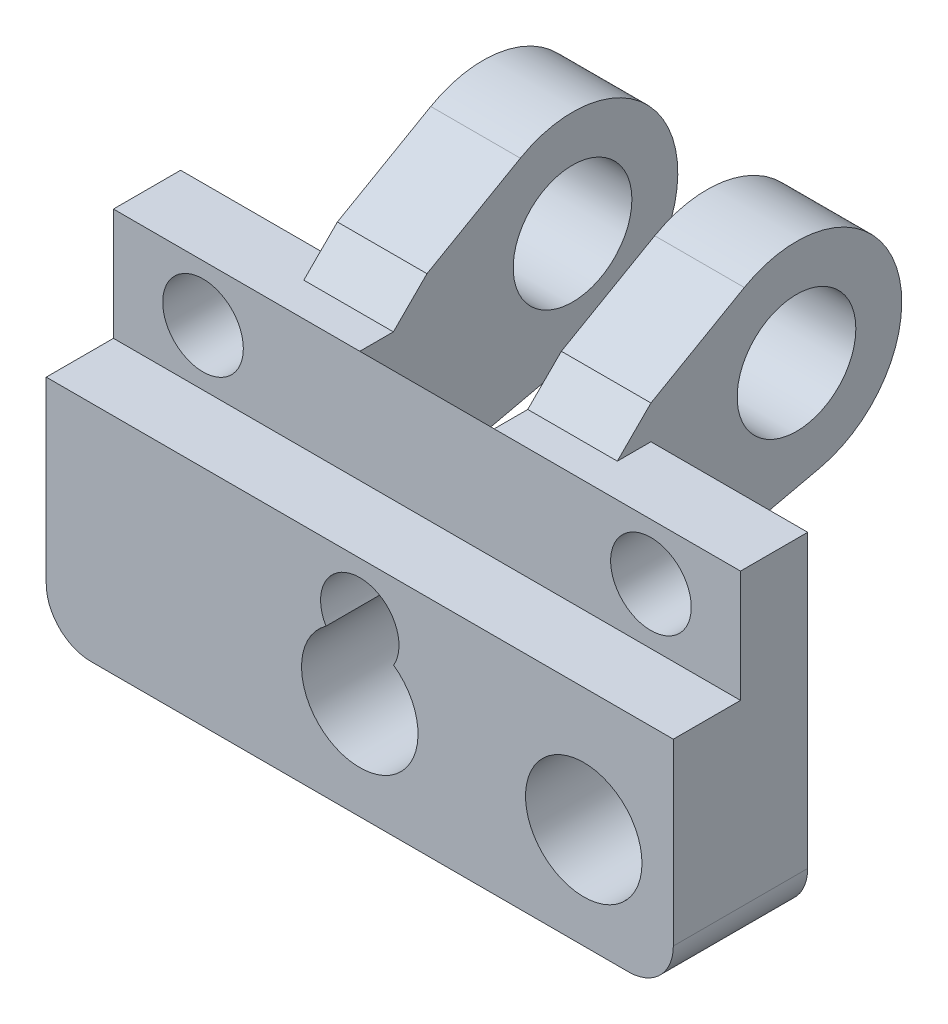
ISO-10303-21;
HEADER;
FILE_DESCRIPTION(('STEP AP214'),'2;1');
FILE_NAME('part.step','',(''),(''),'','','');
FILE_SCHEMA(('AUTOMOTIVE_DESIGN { 1 0 10303 214 1 1 1 1 }'));
ENDSEC;
DATA;
#1=APPLICATION_CONTEXT('core data for automotive mechanical design processes');
#2=APPLICATION_PROTOCOL_DEFINITION('international standard','automotive_design',2000,#1);
#3=PRODUCT_CONTEXT('',#1,'mechanical');
#4=PRODUCT('Part','Part','',(#3));
#5=PRODUCT_RELATED_PRODUCT_CATEGORY('part','',(#4));
#6=PRODUCT_DEFINITION_FORMATION('','',#4);
#7=PRODUCT_DEFINITION_CONTEXT('part definition',#1,'design');
#8=PRODUCT_DEFINITION('design','',#6,#7);
#9=PRODUCT_DEFINITION_SHAPE('','',#8);
#10=(LENGTH_UNIT() NAMED_UNIT(*) SI_UNIT(.MILLI.,.METRE.));
#11=(NAMED_UNIT(*) PLANE_ANGLE_UNIT() SI_UNIT($,.RADIAN.));
#12=(NAMED_UNIT(*) SI_UNIT($,.STERADIAN.) SOLID_ANGLE_UNIT());
#13=UNCERTAINTY_MEASURE_WITH_UNIT(LENGTH_MEASURE(1.E-05),#10,'distance_accuracy_value','');
#14=(GEOMETRIC_REPRESENTATION_CONTEXT(3) GLOBAL_UNCERTAINTY_ASSIGNED_CONTEXT((#13)) GLOBAL_UNIT_ASSIGNED_CONTEXT((#10,
#11,#12)) REPRESENTATION_CONTEXT('',''));
#15=CARTESIAN_POINT('',(0.,0.,0.));
#16=DIRECTION('',(0.,0.,1.));
#17=DIRECTION('',(1.,0.,0.));
#18=AXIS2_PLACEMENT_3D('',#15,#16,#17);
#19=CARTESIAN_POINT('',(0.,2.5,3.));
#20=DIRECTION('',(0.,1.,0.));
#21=DIRECTION('',(0.,0.,1.));
#22=AXIS2_PLACEMENT_3D('',#19,#20,#21);
#23=PLANE('',#22);
#24=DIRECTION('',(1.,0.,0.));
#25=VECTOR('',#24,1.);
#26=CARTESIAN_POINT('',(0.,2.5,0.));
#27=LINE('',#26,#25);
#28=CARTESIAN_POINT('',(7.,2.5,0.));
#29=VERTEX_POINT('',#28);
#30=CARTESIAN_POINT('',(14.,2.5,0.));
#31=VERTEX_POINT('',#30);
#32=EDGE_CURVE('E342',#29,#31,#27,.T.);
#33=ORIENTED_EDGE('',*,*,#32,.F.);
#34=DIRECTION('',(0.,0.,1.));
#35=VECTOR('',#34,1.);
#36=CARTESIAN_POINT('',(7.,2.5,3.));
#37=LINE('',#36,#35);
#38=CARTESIAN_POINT('',(7.,2.5,1.49999999999999));
#39=VERTEX_POINT('',#38);
#40=EDGE_CURVE('E226',#29,#39,#37,.T.);
#41=ORIENTED_EDGE('',*,*,#40,.T.);
#42=DIRECTION('',(-1.,0.,0.));
#43=VECTOR('',#42,1.);
#44=CARTESIAN_POINT('',(0.,2.5,1.49999999999999));
#45=LINE('',#44,#43);
#46=CARTESIAN_POINT('',(3.,2.5,1.49999999999999));
#47=VERTEX_POINT('',#46);
#48=EDGE_CURVE('E388',#39,#47,#45,.T.);
#49=ORIENTED_EDGE('',*,*,#48,.T.);
#50=DIRECTION('',(0.,0.,1.));
#51=VECTOR('',#50,1.);
#52=CARTESIAN_POINT('',(3.,2.5,3.));
#53=LINE('',#52,#51);
#54=CARTESIAN_POINT('',(3.,2.5,3.));
#55=VERTEX_POINT('',#54);
#56=EDGE_CURVE('E373',#47,#55,#53,.T.);
#57=ORIENTED_EDGE('',*,*,#56,.T.);
#58=DIRECTION('',(1.,0.,0.));
#59=VECTOR('',#58,1.);
#60=CARTESIAN_POINT('',(0.,2.5,3.));
#61=LINE('',#60,#59);
#62=CARTESIAN_POINT('',(14.,2.5,3.));
#63=VERTEX_POINT('',#62);
#64=EDGE_CURVE('E329',#55,#63,#61,.T.);
#65=ORIENTED_EDGE('',*,*,#64,.T.);
#66=DIRECTION('',(0.,0.,-1.));
#67=VECTOR('',#66,1.);
#68=CARTESIAN_POINT('',(14.,2.5,3.));
#69=LINE('',#68,#67);
#70=EDGE_CURVE('E352',#63,#31,#69,.T.);
#71=ORIENTED_EDGE('',*,*,#70,.T.);
#72=EDGE_LOOP('',(#33,#41,#49,#57,#65,#71));
#73=FACE_BOUND('',#72,.T.);
#74=ADVANCED_FACE('F43',(#73),#23,.T.);
#75=CARTESIAN_POINT('',(7.,4.,0.));
#76=DIRECTION('',(0.,-0.868337840026812,-0.49597318030068));
#77=DIRECTION('',(0.,0.49597318030068,-0.868337840026812));
#78=AXIS2_PLACEMENT_3D('',#75,#76,#77);
#79=PLANE('',#78);
#80=DIRECTION('',(0.,-0.49597318030068,0.868337840026812));
#81=VECTOR('',#80,1.);
#82=CARTESIAN_POINT('',(3.,4.,0.));
#83=LINE('',#82,#81);
#84=CARTESIAN_POINT('',(3.,6.38118784812602,-4.1689260525868));
#85=VERTEX_POINT('',#84);
#86=CARTESIAN_POINT('',(3.,4.,0.));
#87=VERTEX_POINT('',#86);
#88=EDGE_CURVE('E470',#85,#87,#83,.T.);
#89=ORIENTED_EDGE('',*,*,#88,.T.);
#90=DIRECTION('',(-1.,0.,0.));
#91=VECTOR('',#90,1.);
#92=CARTESIAN_POINT('',(7.,4.,0.));
#93=LINE('',#92,#91);
#94=CARTESIAN_POINT('',(7.,4.,0.));
#95=VERTEX_POINT('',#94);
#96=EDGE_CURVE('E244',#95,#87,#93,.T.);
#97=ORIENTED_EDGE('',*,*,#96,.F.);
#98=DIRECTION('',(0.,-0.49597318030068,0.868337840026812));
#99=VECTOR('',#98,1.);
#100=CARTESIAN_POINT('',(7.,4.,0.));
#101=LINE('',#100,#99);
#102=CARTESIAN_POINT('',(7.,6.38118784812602,-4.1689260525868));
#103=VERTEX_POINT('',#102);
#104=EDGE_CURVE('E491',#103,#95,#101,.T.);
#105=ORIENTED_EDGE('',*,*,#104,.F.);
#106=DIRECTION('',(-1.,0.,0.));
#107=VECTOR('',#106,1.);
#108=CARTESIAN_POINT('',(7.,6.38118784812602,-4.1689260525868));
#109=LINE('',#108,#107);
#110=EDGE_CURVE('E514',#103,#85,#109,.T.);
#111=ORIENTED_EDGE('',*,*,#110,.T.);
#112=EDGE_LOOP('',(#89,#97,#105,#111));
#113=FACE_BOUND('',#112,.T.);
#114=ADVANCED_FACE('F562',(#113),#79,.F.);
#115=CARTESIAN_POINT('',(7.,-2.28274711062134,-7.54327796875606));
#116=DIRECTION('',(0.,0.975052576727944,0.221974035905546));
#117=DIRECTION('',(0.,-0.221974035905546,0.975052576727944));
#118=AXIS2_PLACEMENT_3D('',#115,#116,#117);
#119=PLANE('',#118);
#120=DIRECTION('',(0.,0.221974035905546,-0.975052576727944));
#121=VECTOR('',#120,1.);
#122=CARTESIAN_POINT('',(7.,-2.28274711062134,-7.54327796875606));
#123=LINE('',#122,#121);
#124=CARTESIAN_POINT('',(7.,-3.64575948536253,-1.55605192818891));
#125=VERTEX_POINT('',#124);
#126=CARTESIAN_POINT('',(7.,-2.28274711062134,-7.54327796875606));
#127=VERTEX_POINT('',#126);
#128=EDGE_CURVE('E495',#125,#127,#123,.T.);
#129=ORIENTED_EDGE('',*,*,#128,.F.);
#130=DIRECTION('',(-1.,0.,0.));
#131=VECTOR('',#130,1.);
#132=CARTESIAN_POINT('',(3.,-3.64575948536253,-1.55605192818891));
#133=LINE('',#132,#131);
#134=CARTESIAN_POINT('',(3.,-3.64575948536253,-1.55605192818891));
#135=VERTEX_POINT('',#134);
#136=EDGE_CURVE('E420',#125,#135,#133,.T.);
#137=ORIENTED_EDGE('',*,*,#136,.T.);
#138=DIRECTION('',(0.,0.221974035905546,-0.975052576727944));
#139=VECTOR('',#138,1.);
#140=CARTESIAN_POINT('',(3.,-2.28274711062134,-7.54327796875606));
#141=LINE('',#140,#139);
#142=CARTESIAN_POINT('',(3.,-2.28274711062134,-7.54327796875606));
#143=VERTEX_POINT('',#142);
#144=EDGE_CURVE('E457',#135,#143,#141,.T.);
#145=ORIENTED_EDGE('',*,*,#144,.T.);
#146=DIRECTION('',(-1.,0.,0.));
#147=VECTOR('',#146,1.);
#148=CARTESIAN_POINT('',(7.,-2.28274711062134,-7.54327796875606));
#149=LINE('',#148,#147);
#150=EDGE_CURVE('E245',#127,#143,#149,.T.);
#151=ORIENTED_EDGE('',*,*,#150,.F.);
#152=EDGE_LOOP('',(#129,#137,#145,#151));
#153=FACE_BOUND('',#152,.T.);
#154=ADVANCED_FACE('F571',(#153),#119,.F.);
#155=CARTESIAN_POINT('',(7.,2.3,-6.5));
#156=DIRECTION('',(-1.,0.,0.));
#157=DIRECTION('',(0.,0.,1.));
#158=AXIS2_PLACEMENT_3D('',#155,#156,#157);
#159=CYLINDRICAL_SURFACE('',#158,4.7);
#160=CARTESIAN_POINT('',(3.,2.3,-6.5));
#161=DIRECTION('',(1.,0.,0.));
#162=DIRECTION('',(0.,0.,1.));
#163=AXIS2_PLACEMENT_3D('',#160,#161,#162);
#164=CIRCLE('',#163,4.7);
#165=EDGE_CURVE('E237',#143,#85,#164,.T.);
#166=ORIENTED_EDGE('',*,*,#165,.T.);
#167=ORIENTED_EDGE('',*,*,#110,.F.);
#168=CARTESIAN_POINT('',(7.,2.3,-6.5));
#169=DIRECTION('',(1.,0.,0.));
#170=DIRECTION('',(0.,0.,1.));
#171=AXIS2_PLACEMENT_3D('',#168,#169,#170);
#172=CIRCLE('',#171,4.7);
#173=EDGE_CURVE('E501',#127,#103,#172,.T.);
#174=ORIENTED_EDGE('',*,*,#173,.F.);
#175=ORIENTED_EDGE('',*,*,#150,.T.);
#176=EDGE_LOOP('',(#166,#167,#174,#175));
#177=FACE_BOUND('',#176,.T.);
#178=ADVANCED_FACE('F569',(#177),#159,.T.);
#179=CARTESIAN_POINT('',(7.,2.3,-6.5));
#180=DIRECTION('',(-1.,0.,0.));
#181=DIRECTION('',(0.,0.,1.));
#182=AXIS2_PLACEMENT_3D('',#179,#180,#181);
#183=CYLINDRICAL_SURFACE('',#182,2.65);
#184=CARTESIAN_POINT('',(7.,2.3,-6.5));
#185=DIRECTION('',(1.,0.,0.));
#186=DIRECTION('',(0.,0.,-1.));
#187=AXIS2_PLACEMENT_3D('',#184,#185,#186);
#188=CIRCLE('',#187,2.65);
#189=CARTESIAN_POINT('',(7.,2.3,-9.15));
#190=VERTEX_POINT('',#189);
#191=EDGE_CURVE('E483',#190,#190,#188,.T.);
#192=ORIENTED_EDGE('',*,*,#191,.T.);
#193=EDGE_LOOP('',(#192));
#194=FACE_BOUND('',#193,.T.);
#195=CARTESIAN_POINT('',(3.,2.3,-6.5));
#196=DIRECTION('',(1.,0.,0.));
#197=DIRECTION('',(0.,0.,-1.));
#198=AXIS2_PLACEMENT_3D('',#195,#196,#197);
#199=CIRCLE('',#198,2.65);
#200=CARTESIAN_POINT('',(3.,2.3,-9.15));
#201=VERTEX_POINT('',#200);
#202=EDGE_CURVE('E650',#201,#201,#199,.T.);
#203=ORIENTED_EDGE('',*,*,#202,.F.);
#204=EDGE_LOOP('',(#203));
#205=FACE_BOUND('',#204,.T.);
#206=ADVANCED_FACE('F579',(#194,#205),#183,.F.);
#207=CARTESIAN_POINT('',(14.,0.,3.));
#208=DIRECTION('',(-1.,0.,0.));
#209=DIRECTION('',(0.,0.,1.));
#210=AXIS2_PLACEMENT_3D('',#207,#208,#209);
#211=PLANE('',#210);
#212=DIRECTION('',(0.,-1.,0.));
#213=VECTOR('',#212,1.);
#214=CARTESIAN_POINT('',(14.,0.,6.));
#215=LINE('',#214,#213);
#216=CARTESIAN_POINT('',(14.,-2.5,6.));
#217=VERTEX_POINT('',#216);
#218=CARTESIAN_POINT('',(14.,-10.5,6.));
#219=VERTEX_POINT('',#218);
#220=EDGE_CURVE('E306',#217,#219,#215,.T.);
#221=ORIENTED_EDGE('',*,*,#220,.T.);
#222=DIRECTION('',(0.,0.,-1.));
#223=VECTOR('',#222,1.);
#224=CARTESIAN_POINT('',(14.,-10.5,0.));
#225=LINE('',#224,#223);
#226=CARTESIAN_POINT('',(14.,-10.5,0.));
#227=VERTEX_POINT('',#226);
#228=EDGE_CURVE('E438',#219,#227,#225,.T.);
#229=ORIENTED_EDGE('',*,*,#228,.T.);
#230=DIRECTION('',(0.,1.,0.));
#231=VECTOR('',#230,1.);
#232=CARTESIAN_POINT('',(14.,0.,0.));
#233=LINE('',#232,#231);
#234=EDGE_CURVE('E319',#227,#31,#233,.T.);
#235=ORIENTED_EDGE('',*,*,#234,.T.);
#236=ORIENTED_EDGE('',*,*,#70,.F.);
#237=DIRECTION('',(0.,1.,0.));
#238=VECTOR('',#237,1.);
#239=CARTESIAN_POINT('',(14.,0.,3.));
#240=LINE('',#239,#238);
#241=CARTESIAN_POINT('',(14.,-2.5,3.));
#242=VERTEX_POINT('',#241);
#243=EDGE_CURVE('E324',#242,#63,#240,.T.);
#244=ORIENTED_EDGE('',*,*,#243,.F.);
#245=DIRECTION('',(0.,0.,-1.));
#246=VECTOR('',#245,1.);
#247=CARTESIAN_POINT('',(14.,-2.5,6.));
#248=LINE('',#247,#246);
#249=EDGE_CURVE('E309',#217,#242,#248,.T.);
#250=ORIENTED_EDGE('',*,*,#249,.F.);
#251=EDGE_LOOP('',(#221,#229,#235,#236,#244,#250));
#252=FACE_BOUND('',#251,.T.);
#253=ADVANCED_FACE('F552',(#252),#211,.F.);
#254=DIRECTION('',(0.,0.,-1.));
#255=VECTOR('',#254,1.);
#256=CARTESIAN_POINT('',(-3.,2.5,-6.5));
#257=LINE('',#256,#255);
#258=CARTESIAN_POINT('',(-3.,2.5,3.));
#259=VERTEX_POINT('',#258);
#260=CARTESIAN_POINT('',(-3.,2.5,1.49999999999999));
#261=VERTEX_POINT('',#260);
#262=EDGE_CURVE('E369',#259,#261,#257,.T.);
#263=ORIENTED_EDGE('',*,*,#262,.T.);
#264=DIRECTION('',(-1.,0.,0.));
#265=VECTOR('',#264,1.);
#266=CARTESIAN_POINT('',(0.,2.5,1.49999999999999));
#267=LINE('',#266,#265);
#268=CARTESIAN_POINT('',(-7.,2.5,1.49999999999999));
#269=VERTEX_POINT('',#268);
#270=EDGE_CURVE('E221',#261,#269,#267,.T.);
#271=ORIENTED_EDGE('',*,*,#270,.T.);
#272=DIRECTION('',(0.,0.,-1.));
#273=VECTOR('',#272,1.);
#274=CARTESIAN_POINT('',(-7.,2.5,-6.5));
#275=LINE('',#274,#273);
#276=CARTESIAN_POINT('',(-7.,2.5,0.));
#277=VERTEX_POINT('',#276);
#278=EDGE_CURVE('E383',#269,#277,#275,.T.);
#279=ORIENTED_EDGE('',*,*,#278,.T.);
#280=CARTESIAN_POINT('',(-14.,2.5,0.));
#281=VERTEX_POINT('',#280);
#282=EDGE_CURVE('E343',#281,#277,#27,.T.);
#283=ORIENTED_EDGE('',*,*,#282,.F.);
#284=DIRECTION('',(0.,0.,-1.));
#285=VECTOR('',#284,1.);
#286=CARTESIAN_POINT('',(-14.,2.5,3.));
#287=LINE('',#286,#285);
#288=CARTESIAN_POINT('',(-14.,2.5,3.));
#289=VERTEX_POINT('',#288);
#290=EDGE_CURVE('E339',#289,#281,#287,.T.);
#291=ORIENTED_EDGE('',*,*,#290,.F.);
#292=EDGE_CURVE('E330',#289,#259,#61,.T.);
#293=ORIENTED_EDGE('',*,*,#292,.T.);
#294=EDGE_LOOP('',(#263,#271,#279,#283,#291,#293));
#295=FACE_BOUND('',#294,.T.);
#296=ADVANCED_FACE('F534',(#295),#23,.T.);
#297=CARTESIAN_POINT('',(-14.,0.,3.));
#298=DIRECTION('',(-1.,0.,0.));
#299=DIRECTION('',(0.,0.,1.));
#300=AXIS2_PLACEMENT_3D('',#297,#298,#299);
#301=PLANE('',#300);
#302=DIRECTION('',(0.,1.,0.));
#303=VECTOR('',#302,1.);
#304=CARTESIAN_POINT('',(-14.,0.,0.));
#305=LINE('',#304,#303);
#306=CARTESIAN_POINT('',(-14.,-10.5,0.));
#307=VERTEX_POINT('',#306);
#308=EDGE_CURVE('E325',#307,#281,#305,.T.);
#309=ORIENTED_EDGE('',*,*,#308,.F.);
#310=DIRECTION('',(0.,0.,-1.));
#311=VECTOR('',#310,1.);
#312=CARTESIAN_POINT('',(-14.,-10.5,3.));
#313=LINE('',#312,#311);
#314=CARTESIAN_POINT('',(-14.,-10.5,6.));
#315=VERTEX_POINT('',#314);
#316=EDGE_CURVE('E67',#307,#315,#313,.F.);
#317=ORIENTED_EDGE('',*,*,#316,.T.);
#318=DIRECTION('',(0.,-1.,0.));
#319=VECTOR('',#318,1.);
#320=CARTESIAN_POINT('',(-14.,0.,6.));
#321=LINE('',#320,#319);
#322=CARTESIAN_POINT('',(-14.,-2.5,6.));
#323=VERTEX_POINT('',#322);
#324=EDGE_CURVE('E299',#323,#315,#321,.T.);
#325=ORIENTED_EDGE('',*,*,#324,.F.);
#326=DIRECTION('',(0.,0.,-1.));
#327=VECTOR('',#326,1.);
#328=CARTESIAN_POINT('',(-14.,-2.5,6.));
#329=LINE('',#328,#327);
#330=CARTESIAN_POINT('',(-14.,-2.5,3.));
#331=VERTEX_POINT('',#330);
#332=EDGE_CURVE('E315',#323,#331,#329,.T.);
#333=ORIENTED_EDGE('',*,*,#332,.T.);
#334=DIRECTION('',(0.,1.,0.));
#335=VECTOR('',#334,1.);
#336=CARTESIAN_POINT('',(-14.,0.,3.));
#337=LINE('',#336,#335);
#338=EDGE_CURVE('E334',#331,#289,#337,.T.);
#339=ORIENTED_EDGE('',*,*,#338,.T.);
#340=ORIENTED_EDGE('',*,*,#290,.T.);
#341=EDGE_LOOP('',(#309,#317,#325,#333,#339,#340));
#342=FACE_BOUND('',#341,.T.);
#343=ADVANCED_FACE('F591',(#342),#301,.T.);
#344=CARTESIAN_POINT('',(0.,0.,3.));
#345=DIRECTION('',(0.,0.,1.));
#346=DIRECTION('',(1.,0.,0.));
#347=AXIS2_PLACEMENT_3D('',#344,#345,#346);
#348=PLANE('',#347);
#349=CARTESIAN_POINT('',(10.,0.,3.));
#350=DIRECTION('',(0.,0.,1.));
#351=DIRECTION('',(1.,0.,0.));
#352=AXIS2_PLACEMENT_3D('',#349,#350,#351);
#353=CIRCLE('',#352,1.8);
#354=CARTESIAN_POINT('',(11.8,0.,3.));
#355=VERTEX_POINT('',#354);
#356=EDGE_CURVE('E284',#355,#355,#353,.T.);
#357=ORIENTED_EDGE('',*,*,#356,.F.);
#358=EDGE_LOOP('',(#357));
#359=FACE_BOUND('',#358,.T.);
#360=CARTESIAN_POINT('',(-10.,0.,3.));
#361=DIRECTION('',(0.,0.,1.));
#362=DIRECTION('',(1.,0.,0.));
#363=AXIS2_PLACEMENT_3D('',#360,#361,#362);
#364=CIRCLE('',#363,1.8);
#365=CARTESIAN_POINT('',(-8.2,0.,3.));
#366=VERTEX_POINT('',#365);
#367=EDGE_CURVE('E267',#366,#366,#364,.T.);
#368=ORIENTED_EDGE('',*,*,#367,.F.);
#369=EDGE_LOOP('',(#368));
#370=FACE_BOUND('',#369,.T.);
#371=DIRECTION('',(1.,0.,0.));
#372=VECTOR('',#371,1.);
#373=CARTESIAN_POINT('',(0.,-2.5,3.));
#374=LINE('',#373,#372);
#375=EDGE_CURVE('E320',#331,#242,#374,.T.);
#376=ORIENTED_EDGE('',*,*,#375,.T.);
#377=ORIENTED_EDGE('',*,*,#243,.T.);
#378=ORIENTED_EDGE('',*,*,#64,.F.);
#379=EDGE_CURVE('E335',#259,#55,#61,.T.);
#380=ORIENTED_EDGE('',*,*,#379,.F.);
#381=ORIENTED_EDGE('',*,*,#292,.F.);
#382=ORIENTED_EDGE('',*,*,#338,.F.);
#383=EDGE_LOOP('',(#376,#377,#378,#380,#381,#382));
#384=FACE_BOUND('',#383,.T.);
#385=ADVANCED_FACE('F541',(#359,#370,#384),#348,.T.);
#386=CARTESIAN_POINT('',(0.,0.,0.));
#387=DIRECTION('',(0.,0.,1.));
#388=DIRECTION('',(1.,0.,0.));
#389=AXIS2_PLACEMENT_3D('',#386,#387,#388);
#390=PLANE('',#389);
#391=DIRECTION('',(0.,-1.,0.));
#392=VECTOR('',#391,1.);
#393=CARTESIAN_POINT('',(-7.,4.,0.));
#394=LINE('',#393,#392);
#395=CARTESIAN_POINT('',(-7.,-5.59586463881842,0.));
#396=VERTEX_POINT('',#395);
#397=EDGE_CURVE('E370',#277,#396,#394,.T.);
#398=ORIENTED_EDGE('',*,*,#397,.T.);
#399=DIRECTION('',(-1.,0.,0.));
#400=VECTOR('',#399,1.);
#401=CARTESIAN_POINT('',(-3.,-5.59586463881842,0.));
#402=LINE('',#401,#400);
#403=CARTESIAN_POINT('',(-3.,-5.59586463881842,0.));
#404=VERTEX_POINT('',#403);
#405=EDGE_CURVE('E416',#396,#404,#402,.F.);
#406=ORIENTED_EDGE('',*,*,#405,.T.);
#407=DIRECTION('',(0.,-1.,0.));
#408=VECTOR('',#407,1.);
#409=CARTESIAN_POINT('',(-3.,4.,0.));
#410=LINE('',#409,#408);
#411=CARTESIAN_POINT('',(-3.,-0.499999999999998,0.));
#412=VERTEX_POINT('',#411);
#413=EDGE_CURVE('E236',#412,#404,#410,.T.);
#414=ORIENTED_EDGE('',*,*,#413,.F.);
#415=DIRECTION('',(1.,0.,0.));
#416=VECTOR('',#415,1.);
#417=CARTESIAN_POINT('',(3.,-0.499999999999998,0.));
#418=LINE('',#417,#416);
#419=CARTESIAN_POINT('',(3.,-0.499999999999998,0.));
#420=VERTEX_POINT('',#419);
#421=EDGE_CURVE('E365',#412,#420,#418,.T.);
#422=ORIENTED_EDGE('',*,*,#421,.T.);
#423=DIRECTION('',(0.,-1.,0.));
#424=VECTOR('',#423,1.);
#425=CARTESIAN_POINT('',(3.,4.,0.));
#426=LINE('',#425,#424);
#427=CARTESIAN_POINT('',(3.,-5.59586463881842,0.));
#428=VERTEX_POINT('',#427);
#429=EDGE_CURVE('E455',#420,#428,#426,.T.);
#430=ORIENTED_EDGE('',*,*,#429,.T.);
#431=DIRECTION('',(-1.,0.,0.));
#432=VECTOR('',#431,1.);
#433=CARTESIAN_POINT('',(7.,-5.59586463881842,0.));
#434=LINE('',#433,#432);
#435=CARTESIAN_POINT('',(7.,-5.59586463881842,0.));
#436=VERTEX_POINT('',#435);
#437=EDGE_CURVE('E412',#428,#436,#434,.F.);
#438=ORIENTED_EDGE('',*,*,#437,.T.);
#439=DIRECTION('',(0.,-1.,0.));
#440=VECTOR('',#439,1.);
#441=CARTESIAN_POINT('',(7.,4.,0.));
#442=LINE('',#441,#440);
#443=EDGE_CURVE('E364',#29,#436,#442,.T.);
#444=ORIENTED_EDGE('',*,*,#443,.F.);
#445=ORIENTED_EDGE('',*,*,#32,.T.);
#446=ORIENTED_EDGE('',*,*,#234,.F.);
#447=CARTESIAN_POINT('',(12.,-10.5,0.));
#448=DIRECTION('',(0.,0.,1.));
#449=DIRECTION('',(1.,0.,0.));
#450=AXIS2_PLACEMENT_3D('',#447,#448,#449);
#451=CIRCLE('',#450,2.);
#452=CARTESIAN_POINT('',(12.,-12.5,0.));
#453=VERTEX_POINT('',#452);
#454=EDGE_CURVE('E406',#227,#453,#451,.F.);
#455=ORIENTED_EDGE('',*,*,#454,.T.);
#456=DIRECTION('',(-1.,0.,0.));
#457=VECTOR('',#456,1.);
#458=CARTESIAN_POINT('',(0.,-12.5,0.));
#459=LINE('',#458,#457);
#460=CARTESIAN_POINT('',(-12.,-12.5,0.));
#461=VERTEX_POINT('',#460);
#462=EDGE_CURVE('E283',#453,#461,#459,.T.);
#463=ORIENTED_EDGE('',*,*,#462,.T.);
#464=CARTESIAN_POINT('',(-12.,-10.5,0.));
#465=DIRECTION('',(0.,0.,1.));
#466=DIRECTION('',(1.,0.,0.));
#467=AXIS2_PLACEMENT_3D('',#464,#465,#466);
#468=CIRCLE('',#467,2.);
#469=EDGE_CURVE('E409',#461,#307,#468,.F.);
#470=ORIENTED_EDGE('',*,*,#469,.T.);
#471=ORIENTED_EDGE('',*,*,#308,.T.);
#472=ORIENTED_EDGE('',*,*,#282,.T.);
#473=EDGE_LOOP('',(#398,#406,#414,#422,#430,#438,#444,#445,#446,#455,#463,#470,#471,#472));
#474=FACE_BOUND('',#473,.T.);
#475=CARTESIAN_POINT('',(10.,-8.,0.));
#476=DIRECTION('',(0.,0.,1.));
#477=DIRECTION('',(1.,0.,0.));
#478=AXIS2_PLACEMENT_3D('',#475,#476,#477);
#479=CIRCLE('',#478,2.6);
#480=CARTESIAN_POINT('',(12.6,-8.,0.));
#481=VERTEX_POINT('',#480);
#482=EDGE_CURVE('E263',#481,#481,#479,.T.);
#483=ORIENTED_EDGE('',*,*,#482,.T.);
#484=EDGE_LOOP('',(#483));
#485=FACE_BOUND('',#484,.T.);
#486=CARTESIAN_POINT('',(10.,0.,0.));
#487=DIRECTION('',(0.,0.,1.));
#488=DIRECTION('',(1.,0.,0.));
#489=AXIS2_PLACEMENT_3D('',#486,#487,#488);
#490=CIRCLE('',#489,1.8);
#491=CARTESIAN_POINT('',(11.8,0.,0.));
#492=VERTEX_POINT('',#491);
#493=EDGE_CURVE('E279',#492,#492,#490,.T.);
#494=ORIENTED_EDGE('',*,*,#493,.T.);
#495=EDGE_LOOP('',(#494));
#496=FACE_BOUND('',#495,.T.);
#497=CARTESIAN_POINT('',(-10.,0.,0.));
#498=DIRECTION('',(0.,0.,1.));
#499=DIRECTION('',(1.,0.,0.));
#500=AXIS2_PLACEMENT_3D('',#497,#498,#499);
#501=CIRCLE('',#500,1.8);
#502=CARTESIAN_POINT('',(-8.2,0.,0.));
#503=VERTEX_POINT('',#502);
#504=EDGE_CURVE('E288',#503,#503,#501,.T.);
#505=ORIENTED_EDGE('',*,*,#504,.T.);
#506=EDGE_LOOP('',(#505));
#507=FACE_BOUND('',#506,.T.);
#508=CARTESIAN_POINT('',(0.,-8.,0.));
#509=DIRECTION('',(0.,0.,1.));
#510=DIRECTION('',(1.,0.,0.));
#511=AXIS2_PLACEMENT_3D('',#508,#509,#510);
#512=CIRCLE('',#511,2.6);
#513=CARTESIAN_POINT('',(-1.51045884998566,-5.88375,0.));
#514=VERTEX_POINT('',#513);
#515=CARTESIAN_POINT('',(1.51045884998566,-5.88375,0.));
#516=VERTEX_POINT('',#515);
#517=EDGE_CURVE('E272',#514,#516,#512,.T.);
#518=ORIENTED_EDGE('',*,*,#517,.T.);
#519=CARTESIAN_POINT('',(0.,-5.,0.));
#520=DIRECTION('',(0.,0.,-1.));
#521=DIRECTION('',(-1.,0.,0.));
#522=AXIS2_PLACEMENT_3D('',#519,#520,#521);
#523=CIRCLE('',#522,1.75);
#524=EDGE_CURVE('E250',#514,#516,#523,.T.);
#525=ORIENTED_EDGE('',*,*,#524,.F.);
#526=EDGE_LOOP('',(#518,#525));
#527=FACE_BOUND('',#526,.T.);
#528=ADVANCED_FACE('F464',(#474,#485,#496,#507,#527),#390,.F.);
#529=CARTESIAN_POINT('',(0.,-2.5,6.));
#530=DIRECTION('',(0.,1.,0.));
#531=DIRECTION('',(-1.,0.,0.));
#532=AXIS2_PLACEMENT_3D('',#529,#530,#531);
#533=PLANE('',#532);
#534=ORIENTED_EDGE('',*,*,#375,.F.);
#535=ORIENTED_EDGE('',*,*,#332,.F.);
#536=DIRECTION('',(1.,0.,0.));
#537=VECTOR('',#536,1.);
#538=CARTESIAN_POINT('',(0.,-2.5,6.));
#539=LINE('',#538,#537);
#540=EDGE_CURVE('E295',#323,#217,#539,.T.);
#541=ORIENTED_EDGE('',*,*,#540,.T.);
#542=ORIENTED_EDGE('',*,*,#249,.T.);
#543=EDGE_LOOP('',(#534,#535,#541,#542));
#544=FACE_BOUND('',#543,.T.);
#545=ADVANCED_FACE('F764',(#544),#533,.T.);
#546=CARTESIAN_POINT('',(0.,-12.5,6.));
#547=DIRECTION('',(0.,-1.,0.));
#548=DIRECTION('',(1.,0.,0.));
#549=AXIS2_PLACEMENT_3D('',#546,#547,#548);
#550=PLANE('',#549);
#551=DIRECTION('',(-1.,0.,0.));
#552=VECTOR('',#551,1.);
#553=CARTESIAN_POINT('',(0.,-12.5,6.));
#554=LINE('',#553,#552);
#555=CARTESIAN_POINT('',(12.,-12.5,6.));
#556=VERTEX_POINT('',#555);
#557=CARTESIAN_POINT('',(-12.,-12.5,6.));
#558=VERTEX_POINT('',#557);
#559=EDGE_CURVE('E302',#556,#558,#554,.T.);
#560=ORIENTED_EDGE('',*,*,#559,.T.);
#561=DIRECTION('',(0.,0.,-1.));
#562=VECTOR('',#561,1.);
#563=CARTESIAN_POINT('',(-12.,-12.5,6.));
#564=LINE('',#563,#562);
#565=EDGE_CURVE('E427',#558,#461,#564,.T.);
#566=ORIENTED_EDGE('',*,*,#565,.T.);
#567=ORIENTED_EDGE('',*,*,#462,.F.);
#568=DIRECTION('',(0.,0.,-1.));
#569=VECTOR('',#568,1.);
#570=CARTESIAN_POINT('',(12.,-12.5,6.));
#571=LINE('',#570,#569);
#572=EDGE_CURVE('E424',#453,#556,#571,.F.);
#573=ORIENTED_EDGE('',*,*,#572,.T.);
#574=EDGE_LOOP('',(#560,#566,#567,#573));
#575=FACE_BOUND('',#574,.T.);
#576=ADVANCED_FACE('F636',(#575),#550,.T.);
#577=CARTESIAN_POINT('',(0.,0.,6.));
#578=DIRECTION('',(0.,0.,1.));
#579=DIRECTION('',(1.,0.,0.));
#580=AXIS2_PLACEMENT_3D('',#577,#578,#579);
#581=PLANE('',#580);
#582=CARTESIAN_POINT('',(0.,-5.,6.));
#583=DIRECTION('',(0.,0.,-1.));
#584=DIRECTION('',(-1.,0.,0.));
#585=AXIS2_PLACEMENT_3D('',#582,#583,#584);
#586=CIRCLE('',#585,1.75);
#587=CARTESIAN_POINT('',(-1.51045884998566,-5.88375,6.));
#588=VERTEX_POINT('',#587);
#589=CARTESIAN_POINT('',(1.51045884998566,-5.88375,6.));
#590=VERTEX_POINT('',#589);
#591=EDGE_CURVE('E256',#588,#590,#586,.T.);
#592=ORIENTED_EDGE('',*,*,#591,.T.);
#593=CARTESIAN_POINT('',(0.,-8.,6.));
#594=DIRECTION('',(0.,0.,1.));
#595=DIRECTION('',(1.,0.,0.));
#596=AXIS2_PLACEMENT_3D('',#593,#594,#595);
#597=CIRCLE('',#596,2.6);
#598=EDGE_CURVE('E260',#588,#590,#597,.T.);
#599=ORIENTED_EDGE('',*,*,#598,.F.);
#600=EDGE_LOOP('',(#592,#599));
#601=FACE_BOUND('',#600,.T.);
#602=CARTESIAN_POINT('',(10.,-8.,6.));
#603=DIRECTION('',(0.,0.,1.));
#604=DIRECTION('',(1.,0.,0.));
#605=AXIS2_PLACEMENT_3D('',#602,#603,#604);
#606=CIRCLE('',#605,2.6);
#607=CARTESIAN_POINT('',(12.6,-8.,6.));
#608=VERTEX_POINT('',#607);
#609=EDGE_CURVE('E268',#608,#608,#606,.T.);
#610=ORIENTED_EDGE('',*,*,#609,.F.);
#611=EDGE_LOOP('',(#610));
#612=FACE_BOUND('',#611,.T.);
#613=ORIENTED_EDGE('',*,*,#324,.T.);
#614=CARTESIAN_POINT('',(-12.,-10.5,6.));
#615=DIRECTION('',(0.,0.,1.));
#616=DIRECTION('',(1.,0.,0.));
#617=AXIS2_PLACEMENT_3D('',#614,#615,#616);
#618=CIRCLE('',#617,2.);
#619=EDGE_CURVE('E435',#315,#558,#618,.T.);
#620=ORIENTED_EDGE('',*,*,#619,.T.);
#621=ORIENTED_EDGE('',*,*,#559,.F.);
#622=CARTESIAN_POINT('',(12.,-10.5,6.));
#623=DIRECTION('',(0.,0.,1.));
#624=DIRECTION('',(1.,0.,0.));
#625=AXIS2_PLACEMENT_3D('',#622,#623,#624);
#626=CIRCLE('',#625,2.);
#627=EDGE_CURVE('E59',#556,#219,#626,.T.);
#628=ORIENTED_EDGE('',*,*,#627,.T.);
#629=ORIENTED_EDGE('',*,*,#220,.F.);
#630=ORIENTED_EDGE('',*,*,#540,.F.);
#631=EDGE_LOOP('',(#613,#620,#621,#628,#629,#630));
#632=FACE_BOUND('',#631,.T.);
#633=ADVANCED_FACE('F633',(#601,#612,#632),#581,.T.);
#634=CARTESIAN_POINT('',(-10.,0.,0.));
#635=DIRECTION('',(0.,0.,1.));
#636=DIRECTION('',(1.,0.,0.));
#637=AXIS2_PLACEMENT_3D('',#634,#635,#636);
#638=CYLINDRICAL_SURFACE('',#637,1.8);
#639=ORIENTED_EDGE('',*,*,#504,.F.);
#640=EDGE_LOOP('',(#639));
#641=FACE_BOUND('',#640,.T.);
#642=ORIENTED_EDGE('',*,*,#367,.T.);
#643=EDGE_LOOP('',(#642));
#644=FACE_BOUND('',#643,.T.);
#645=ADVANCED_FACE('F784',(#641,#644),#638,.F.);
#646=CARTESIAN_POINT('',(10.,0.,0.));
#647=DIRECTION('',(0.,0.,1.));
#648=DIRECTION('',(1.,0.,0.));
#649=AXIS2_PLACEMENT_3D('',#646,#647,#648);
#650=CYLINDRICAL_SURFACE('',#649,1.8);
#651=ORIENTED_EDGE('',*,*,#493,.F.);
#652=EDGE_LOOP('',(#651));
#653=FACE_BOUND('',#652,.T.);
#654=ORIENTED_EDGE('',*,*,#356,.T.);
#655=EDGE_LOOP('',(#654));
#656=FACE_BOUND('',#655,.T.);
#657=ADVANCED_FACE('F857',(#653,#656),#650,.F.);
#658=CARTESIAN_POINT('',(0.,-8.,0.));
#659=DIRECTION('',(0.,0.,1.));
#660=DIRECTION('',(1.,0.,0.));
#661=AXIS2_PLACEMENT_3D('',#658,#659,#660);
#662=CYLINDRICAL_SURFACE('',#661,2.6);
#663=ORIENTED_EDGE('',*,*,#517,.F.);
#664=DIRECTION('',(0.,0.,-1.));
#665=VECTOR('',#664,1.);
#666=CARTESIAN_POINT('',(-1.51045884998566,-5.88375,3.));
#667=LINE('',#666,#665);
#668=EDGE_CURVE('E360',#514,#588,#667,.F.);
#669=ORIENTED_EDGE('',*,*,#668,.T.);
#670=ORIENTED_EDGE('',*,*,#598,.T.);
#671=DIRECTION('',(0.,0.,-1.));
#672=VECTOR('',#671,1.);
#673=CARTESIAN_POINT('',(1.51045884998566,-5.88375,3.));
#674=LINE('',#673,#672);
#675=EDGE_CURVE('E356',#590,#516,#674,.T.);
#676=ORIENTED_EDGE('',*,*,#675,.T.);
#677=EDGE_LOOP('',(#663,#669,#670,#676));
#678=FACE_BOUND('',#677,.T.);
#679=ADVANCED_FACE('F848',(#678),#662,.F.);
#680=CARTESIAN_POINT('',(10.,-8.,0.));
#681=DIRECTION('',(0.,0.,1.));
#682=DIRECTION('',(1.,0.,0.));
#683=AXIS2_PLACEMENT_3D('',#680,#681,#682);
#684=CYLINDRICAL_SURFACE('',#683,2.6);
#685=ORIENTED_EDGE('',*,*,#482,.F.);
#686=EDGE_LOOP('',(#685));
#687=FACE_BOUND('',#686,.T.);
#688=ORIENTED_EDGE('',*,*,#609,.T.);
#689=EDGE_LOOP('',(#688));
#690=FACE_BOUND('',#689,.T.);
#691=ADVANCED_FACE('F840',(#687,#690),#684,.F.);
#692=CARTESIAN_POINT('',(0.,-5.,6.));
#693=DIRECTION('',(0.,0.,-1.));
#694=DIRECTION('',(-1.,0.,0.));
#695=AXIS2_PLACEMENT_3D('',#692,#693,#694);
#696=CYLINDRICAL_SURFACE('',#695,1.75);
#697=ORIENTED_EDGE('',*,*,#524,.T.);
#698=ORIENTED_EDGE('',*,*,#675,.F.);
#699=ORIENTED_EDGE('',*,*,#591,.F.);
#700=ORIENTED_EDGE('',*,*,#668,.F.);
#701=EDGE_LOOP('',(#697,#698,#699,#700));
#702=FACE_BOUND('',#701,.T.);
#703=ADVANCED_FACE('F671',(#702),#696,.F.);
#704=CARTESIAN_POINT('',(7.,2.3,-6.5));
#705=DIRECTION('',(-1.,0.,0.));
#706=DIRECTION('',(0.,0.,1.));
#707=AXIS2_PLACEMENT_3D('',#704,#705,#706);
#708=PLANE('',#707);
#709=ORIENTED_EDGE('',*,*,#104,.T.);
#710=DIRECTION('',(0.,-0.70710678118655,0.707106781186545));
#711=VECTOR('',#710,1.);
#712=CARTESIAN_POINT('',(7.,6.4,-2.39999999999998));
#713=LINE('',#712,#711);
#714=EDGE_CURVE('E396',#95,#39,#713,.T.);
#715=ORIENTED_EDGE('',*,*,#714,.T.);
#716=ORIENTED_EDGE('',*,*,#40,.F.);
#717=ORIENTED_EDGE('',*,*,#443,.T.);
#718=CARTESIAN_POINT('',(7.,-5.59586463881842,-2.));
#719=DIRECTION('',(-1.,0.,0.));
#720=DIRECTION('',(0.,0.,1.));
#721=AXIS2_PLACEMENT_3D('',#718,#719,#720);
#722=CIRCLE('',#721,2.);
#723=EDGE_CURVE('E11',#436,#125,#722,.T.);
#724=ORIENTED_EDGE('',*,*,#723,.T.);
#725=ORIENTED_EDGE('',*,*,#128,.T.);
#726=ORIENTED_EDGE('',*,*,#173,.T.);
#727=EDGE_LOOP('',(#709,#715,#716,#717,#724,#725,#726));
#728=FACE_BOUND('',#727,.T.);
#729=ORIENTED_EDGE('',*,*,#191,.F.);
#730=EDGE_LOOP('',(#729));
#731=FACE_BOUND('',#730,.T.);
#732=ADVANCED_FACE('F563',(#728,#731),#708,.F.);
#733=CARTESIAN_POINT('',(-7.,2.3,-6.5));
#734=DIRECTION('',(-1.,0.,0.));
#735=DIRECTION('',(0.,0.,1.));
#736=AXIS2_PLACEMENT_3D('',#733,#734,#735);
#737=PLANE('',#736);
#738=DIRECTION('',(0.,-0.49597318030068,0.868337840026812));
#739=VECTOR('',#738,1.);
#740=CARTESIAN_POINT('',(-7.,4.,0.));
#741=LINE('',#740,#739);
#742=CARTESIAN_POINT('',(-7.,6.38118784812602,-4.1689260525868));
#743=VERTEX_POINT('',#742);
#744=CARTESIAN_POINT('',(-7.,4.,0.));
#745=VERTEX_POINT('',#744);
#746=EDGE_CURVE('E242',#743,#745,#741,.T.);
#747=ORIENTED_EDGE('',*,*,#746,.F.);
#748=CARTESIAN_POINT('',(-7.,2.3,-6.5));
#749=DIRECTION('',(1.,0.,0.));
#750=DIRECTION('',(0.,0.,1.));
#751=AXIS2_PLACEMENT_3D('',#748,#749,#750);
#752=CIRCLE('',#751,4.7);
#753=CARTESIAN_POINT('',(-7.,-2.28274711062134,-7.54327796875606));
#754=VERTEX_POINT('',#753);
#755=EDGE_CURVE('E496',#754,#743,#752,.T.);
#756=ORIENTED_EDGE('',*,*,#755,.F.);
#757=DIRECTION('',(0.,0.221974035905546,-0.975052576727944));
#758=VECTOR('',#757,1.);
#759=CARTESIAN_POINT('',(-7.,-2.28274711062134,-7.54327796875606));
#760=LINE('',#759,#758);
#761=CARTESIAN_POINT('',(-7.,-3.64575948536253,-1.55605192818891));
#762=VERTEX_POINT('',#761);
#763=EDGE_CURVE('E507',#762,#754,#760,.T.);
#764=ORIENTED_EDGE('',*,*,#763,.F.);
#765=CARTESIAN_POINT('',(-7.,-5.59586463881842,-2.));
#766=DIRECTION('',(-1.,0.,0.));
#767=DIRECTION('',(0.,0.,1.));
#768=AXIS2_PLACEMENT_3D('',#765,#766,#767);
#769=CIRCLE('',#768,2.);
#770=EDGE_CURVE('E442',#762,#396,#769,.F.);
#771=ORIENTED_EDGE('',*,*,#770,.T.);
#772=ORIENTED_EDGE('',*,*,#397,.F.);
#773=ORIENTED_EDGE('',*,*,#278,.F.);
#774=DIRECTION('',(0.,0.70710678118655,-0.707106781186545));
#775=VECTOR('',#774,1.);
#776=CARTESIAN_POINT('',(-7.,4.,0.));
#777=LINE('',#776,#775);
#778=EDGE_CURVE('E225',#269,#745,#777,.T.);
#779=ORIENTED_EDGE('',*,*,#778,.T.);
#780=EDGE_LOOP('',(#747,#756,#764,#771,#772,#773,#779));
#781=FACE_BOUND('',#780,.T.);
#782=CARTESIAN_POINT('',(-7.,2.3,-6.5));
#783=DIRECTION('',(1.,0.,0.));
#784=DIRECTION('',(0.,0.,-1.));
#785=AXIS2_PLACEMENT_3D('',#782,#783,#784);
#786=CIRCLE('',#785,2.65);
#787=CARTESIAN_POINT('',(-7.,2.3,-9.15));
#788=VERTEX_POINT('',#787);
#789=EDGE_CURVE('E487',#788,#788,#786,.T.);
#790=ORIENTED_EDGE('',*,*,#789,.T.);
#791=EDGE_LOOP('',(#790));
#792=FACE_BOUND('',#791,.T.);
#793=ADVANCED_FACE('F529',(#781,#792),#737,.T.);
#794=CARTESIAN_POINT('',(-3.,4.,0.));
#795=VERTEX_POINT('',#794);
#796=EDGE_CURVE('E219',#795,#745,#93,.T.);
#797=ORIENTED_EDGE('',*,*,#796,.F.);
#798=DIRECTION('',(0.,-0.49597318030068,0.868337840026812));
#799=VECTOR('',#798,1.);
#800=CARTESIAN_POINT('',(-3.,4.,0.));
#801=LINE('',#800,#799);
#802=CARTESIAN_POINT('',(-3.,6.38118784812602,-4.1689260525868));
#803=VERTEX_POINT('',#802);
#804=EDGE_CURVE('E229',#803,#795,#801,.T.);
#805=ORIENTED_EDGE('',*,*,#804,.F.);
#806=EDGE_CURVE('E504',#803,#743,#109,.T.);
#807=ORIENTED_EDGE('',*,*,#806,.T.);
#808=ORIENTED_EDGE('',*,*,#746,.T.);
#809=EDGE_LOOP('',(#797,#805,#807,#808));
#810=FACE_BOUND('',#809,.T.);
#811=ADVANCED_FACE('F240',(#810),#79,.F.);
#812=DIRECTION('',(0.,0.221974035905546,-0.975052576727944));
#813=VECTOR('',#812,1.);
#814=CARTESIAN_POINT('',(-3.,-2.28274711062134,-7.54327796875606));
#815=LINE('',#814,#813);
#816=CARTESIAN_POINT('',(-3.,-3.64575948536253,-1.55605192818891));
#817=VERTEX_POINT('',#816);
#818=CARTESIAN_POINT('',(-3.,-2.28274711062134,-7.54327796875606));
#819=VERTEX_POINT('',#818);
#820=EDGE_CURVE('E643',#817,#819,#815,.T.);
#821=ORIENTED_EDGE('',*,*,#820,.F.);
#822=DIRECTION('',(-1.,0.,0.));
#823=VECTOR('',#822,1.);
#824=CARTESIAN_POINT('',(-7.,-3.64575948536253,-1.55605192818891));
#825=LINE('',#824,#823);
#826=EDGE_CURVE('E402',#817,#762,#825,.T.);
#827=ORIENTED_EDGE('',*,*,#826,.T.);
#828=ORIENTED_EDGE('',*,*,#763,.T.);
#829=EDGE_CURVE('E252',#819,#754,#149,.T.);
#830=ORIENTED_EDGE('',*,*,#829,.F.);
#831=EDGE_LOOP('',(#821,#827,#828,#830));
#832=FACE_BOUND('',#831,.T.);
#833=ADVANCED_FACE('F574',(#832),#119,.F.);
#834=ORIENTED_EDGE('',*,*,#806,.F.);
#835=CARTESIAN_POINT('',(-3.,2.3,-6.5));
#836=DIRECTION('',(1.,0.,0.));
#837=DIRECTION('',(0.,0.,1.));
#838=AXIS2_PLACEMENT_3D('',#835,#836,#837);
#839=CIRCLE('',#838,4.7);
#840=EDGE_CURVE('E232',#819,#803,#839,.T.);
#841=ORIENTED_EDGE('',*,*,#840,.F.);
#842=ORIENTED_EDGE('',*,*,#829,.T.);
#843=ORIENTED_EDGE('',*,*,#755,.T.);
#844=EDGE_LOOP('',(#834,#841,#842,#843));
#845=FACE_BOUND('',#844,.T.);
#846=ADVANCED_FACE('F525',(#845),#159,.T.);
#847=CARTESIAN_POINT('',(-3.,2.3,-6.5));
#848=DIRECTION('',(1.,0.,0.));
#849=DIRECTION('',(0.,0.,-1.));
#850=AXIS2_PLACEMENT_3D('',#847,#848,#849);
#851=CIRCLE('',#850,2.65);
#852=CARTESIAN_POINT('',(-3.,2.3,-9.15));
#853=VERTEX_POINT('',#852);
#854=EDGE_CURVE('E476',#853,#853,#851,.T.);
#855=ORIENTED_EDGE('',*,*,#854,.T.);
#856=EDGE_LOOP('',(#855));
#857=FACE_BOUND('',#856,.T.);
#858=ORIENTED_EDGE('',*,*,#789,.F.);
#859=EDGE_LOOP('',(#858));
#860=FACE_BOUND('',#859,.T.);
#861=ADVANCED_FACE('F601',(#857,#860),#183,.F.);
#862=CARTESIAN_POINT('',(-3.,2.3,-6.5));
#863=DIRECTION('',(-1.,0.,0.));
#864=DIRECTION('',(0.,0.,1.));
#865=AXIS2_PLACEMENT_3D('',#862,#863,#864);
#866=PLANE('',#865);
#867=ORIENTED_EDGE('',*,*,#854,.F.);
#868=EDGE_LOOP('',(#867));
#869=FACE_BOUND('',#868,.T.);
#870=ORIENTED_EDGE('',*,*,#804,.T.);
#871=DIRECTION('',(0.,-0.70710678118655,0.707106781186545));
#872=VECTOR('',#871,1.);
#873=CARTESIAN_POINT('',(-3.,6.4,-2.39999999999998));
#874=LINE('',#873,#872);
#875=EDGE_CURVE('E214',#795,#261,#874,.T.);
#876=ORIENTED_EDGE('',*,*,#875,.T.);
#877=ORIENTED_EDGE('',*,*,#262,.F.);
#878=DIRECTION('',(0.,-0.707106781186547,-0.707106781186548));
#879=VECTOR('',#878,1.);
#880=CARTESIAN_POINT('',(-3.,-2.35,-1.85));
#881=LINE('',#880,#879);
#882=EDGE_CURVE('E380',#259,#412,#881,.T.);
#883=ORIENTED_EDGE('',*,*,#882,.T.);
#884=ORIENTED_EDGE('',*,*,#413,.T.);
#885=CARTESIAN_POINT('',(-3.,-5.59586463881842,-2.));
#886=DIRECTION('',(-1.,0.,0.));
#887=DIRECTION('',(0.,0.,1.));
#888=AXIS2_PLACEMENT_3D('',#885,#886,#887);
#889=CIRCLE('',#888,2.);
#890=EDGE_CURVE('E446',#404,#817,#889,.T.);
#891=ORIENTED_EDGE('',*,*,#890,.T.);
#892=ORIENTED_EDGE('',*,*,#820,.T.);
#893=ORIENTED_EDGE('',*,*,#840,.T.);
#894=EDGE_LOOP('',(#870,#876,#877,#883,#884,#891,#892,#893));
#895=FACE_BOUND('',#894,.T.);
#896=ADVANCED_FACE('F230',(#869,#895),#866,.F.);
#897=CARTESIAN_POINT('',(3.,2.3,-6.5));
#898=DIRECTION('',(-1.,0.,0.));
#899=DIRECTION('',(0.,0.,1.));
#900=AXIS2_PLACEMENT_3D('',#897,#898,#899);
#901=PLANE('',#900);
#902=ORIENTED_EDGE('',*,*,#202,.T.);
#903=EDGE_LOOP('',(#902));
#904=FACE_BOUND('',#903,.T.);
#905=ORIENTED_EDGE('',*,*,#88,.F.);
#906=ORIENTED_EDGE('',*,*,#165,.F.);
#907=ORIENTED_EDGE('',*,*,#144,.F.);
#908=CARTESIAN_POINT('',(3.,-5.59586463881842,-2.));
#909=DIRECTION('',(-1.,0.,0.));
#910=DIRECTION('',(0.,0.,1.));
#911=AXIS2_PLACEMENT_3D('',#908,#909,#910);
#912=CIRCLE('',#911,2.);
#913=EDGE_CURVE('E52',#135,#428,#912,.F.);
#914=ORIENTED_EDGE('',*,*,#913,.T.);
#915=ORIENTED_EDGE('',*,*,#429,.F.);
#916=DIRECTION('',(0.,0.707106781186547,0.707106781186548));
#917=VECTOR('',#916,1.);
#918=CARTESIAN_POINT('',(3.,-0.499999999999998,0.));
#919=LINE('',#918,#917);
#920=EDGE_CURVE('E376',#420,#55,#919,.T.);
#921=ORIENTED_EDGE('',*,*,#920,.T.);
#922=ORIENTED_EDGE('',*,*,#56,.F.);
#923=DIRECTION('',(0.,0.70710678118655,-0.707106781186545));
#924=VECTOR('',#923,1.);
#925=CARTESIAN_POINT('',(3.,4.,0.));
#926=LINE('',#925,#924);
#927=EDGE_CURVE('E399',#47,#87,#926,.T.);
#928=ORIENTED_EDGE('',*,*,#927,.T.);
#929=EDGE_LOOP('',(#905,#906,#907,#914,#915,#921,#922,#928));
#930=FACE_BOUND('',#929,.T.);
#931=ADVANCED_FACE('F454',(#904,#930),#901,.T.);
#932=CARTESIAN_POINT('',(0.,-0.499999999999998,0.));
#933=DIRECTION('',(0.,0.707106781186548,-0.707106781186547));
#934=DIRECTION('',(-1.,0.,0.));
#935=AXIS2_PLACEMENT_3D('',#932,#933,#934);
#936=PLANE('',#935);
#937=ORIENTED_EDGE('',*,*,#882,.F.);
#938=ORIENTED_EDGE('',*,*,#379,.T.);
#939=ORIENTED_EDGE('',*,*,#920,.F.);
#940=ORIENTED_EDGE('',*,*,#421,.F.);
#941=EDGE_LOOP('',(#937,#938,#939,#940));
#942=FACE_BOUND('',#941,.T.);
#943=ADVANCED_FACE('F604',(#942),#936,.T.);
#944=CARTESIAN_POINT('',(7.,4.,0.));
#945=DIRECTION('',(0.,-0.707106781186545,-0.70710678118655));
#946=DIRECTION('',(1.,0.,0.));
#947=AXIS2_PLACEMENT_3D('',#944,#945,#946);
#948=PLANE('',#947);
#949=ORIENTED_EDGE('',*,*,#778,.F.);
#950=ORIENTED_EDGE('',*,*,#270,.F.);
#951=ORIENTED_EDGE('',*,*,#875,.F.);
#952=ORIENTED_EDGE('',*,*,#796,.T.);
#953=EDGE_LOOP('',(#949,#950,#951,#952));
#954=FACE_BOUND('',#953,.T.);
#955=ADVANCED_FACE('F217',(#954),#948,.F.);
#956=CARTESIAN_POINT('',(7.,4.,0.));
#957=DIRECTION('',(0.,-0.707106781186545,-0.70710678118655));
#958=DIRECTION('',(1.,0.,0.));
#959=AXIS2_PLACEMENT_3D('',#956,#957,#958);
#960=PLANE('',#959);
#961=ORIENTED_EDGE('',*,*,#927,.F.);
#962=ORIENTED_EDGE('',*,*,#48,.F.);
#963=ORIENTED_EDGE('',*,*,#714,.F.);
#964=ORIENTED_EDGE('',*,*,#96,.T.);
#965=EDGE_LOOP('',(#961,#962,#963,#964));
#966=FACE_BOUND('',#965,.T.);
#967=ADVANCED_FACE('F560',(#966),#960,.F.);
#968=CARTESIAN_POINT('',(7.,-5.59586463881842,-2.));
#969=DIRECTION('',(1.,0.,0.));
#970=DIRECTION('',(0.,0.,-1.));
#971=AXIS2_PLACEMENT_3D('',#968,#969,#970);
#972=CYLINDRICAL_SURFACE('',#971,2.);
#973=ORIENTED_EDGE('',*,*,#890,.F.);
#974=ORIENTED_EDGE('',*,*,#405,.F.);
#975=ORIENTED_EDGE('',*,*,#770,.F.);
#976=ORIENTED_EDGE('',*,*,#826,.F.);
#977=EDGE_LOOP('',(#973,#974,#975,#976));
#978=FACE_BOUND('',#977,.T.);
#979=ADVANCED_FACE('F619',(#978),#972,.F.);
#980=CARTESIAN_POINT('',(7.,-5.59586463881842,-2.));
#981=DIRECTION('',(1.,0.,0.));
#982=DIRECTION('',(0.,0.,-1.));
#983=AXIS2_PLACEMENT_3D('',#980,#981,#982);
#984=CYLINDRICAL_SURFACE('',#983,2.);
#985=ORIENTED_EDGE('',*,*,#723,.F.);
#986=ORIENTED_EDGE('',*,*,#437,.F.);
#987=ORIENTED_EDGE('',*,*,#913,.F.);
#988=ORIENTED_EDGE('',*,*,#136,.F.);
#989=EDGE_LOOP('',(#985,#986,#987,#988));
#990=FACE_BOUND('',#989,.T.);
#991=ADVANCED_FACE('F461',(#990),#984,.F.);
#992=CARTESIAN_POINT('',(-12.,-10.5,6.));
#993=DIRECTION('',(0.,0.,-1.));
#994=DIRECTION('',(-1.,0.,0.));
#995=AXIS2_PLACEMENT_3D('',#992,#993,#994);
#996=CYLINDRICAL_SURFACE('',#995,2.);
#997=ORIENTED_EDGE('',*,*,#619,.F.);
#998=ORIENTED_EDGE('',*,*,#316,.F.);
#999=ORIENTED_EDGE('',*,*,#469,.F.);
#1000=ORIENTED_EDGE('',*,*,#565,.F.);
#1001=EDGE_LOOP('',(#997,#998,#999,#1000));
#1002=FACE_BOUND('',#1001,.T.);
#1003=ADVANCED_FACE('F624',(#1002),#996,.T.);
#1004=CARTESIAN_POINT('',(12.,-10.5,3.));
#1005=DIRECTION('',(0.,0.,1.));
#1006=DIRECTION('',(1.,0.,0.));
#1007=AXIS2_PLACEMENT_3D('',#1004,#1005,#1006);
#1008=CYLINDRICAL_SURFACE('',#1007,2.);
#1009=ORIENTED_EDGE('',*,*,#627,.F.);
#1010=ORIENTED_EDGE('',*,*,#572,.F.);
#1011=ORIENTED_EDGE('',*,*,#454,.F.);
#1012=ORIENTED_EDGE('',*,*,#228,.F.);
#1013=EDGE_LOOP('',(#1009,#1010,#1011,#1012));
#1014=FACE_BOUND('',#1013,.T.);
#1015=ADVANCED_FACE('F45',(#1014),#1008,.T.);
#1016=CLOSED_SHELL('',(#74,#114,#154,#178,#206,#253,#296,#343,#385,#528,#545,#576,#633,#645,
#657,#679,#691,#703,#732,#793,#811,#833,#846,#861,#896,#931,#943,#955,#967,#979,#991,#1003,#1015));
#1017=MANIFOLD_SOLID_BREP('B2',#1016);
#1018=ADVANCED_BREP_SHAPE_REPRESENTATION('',(#18,#1017),#14);
#1019=SHAPE_DEFINITION_REPRESENTATION(#9,#1018);
ENDSEC;
END-ISO-10303-21;
